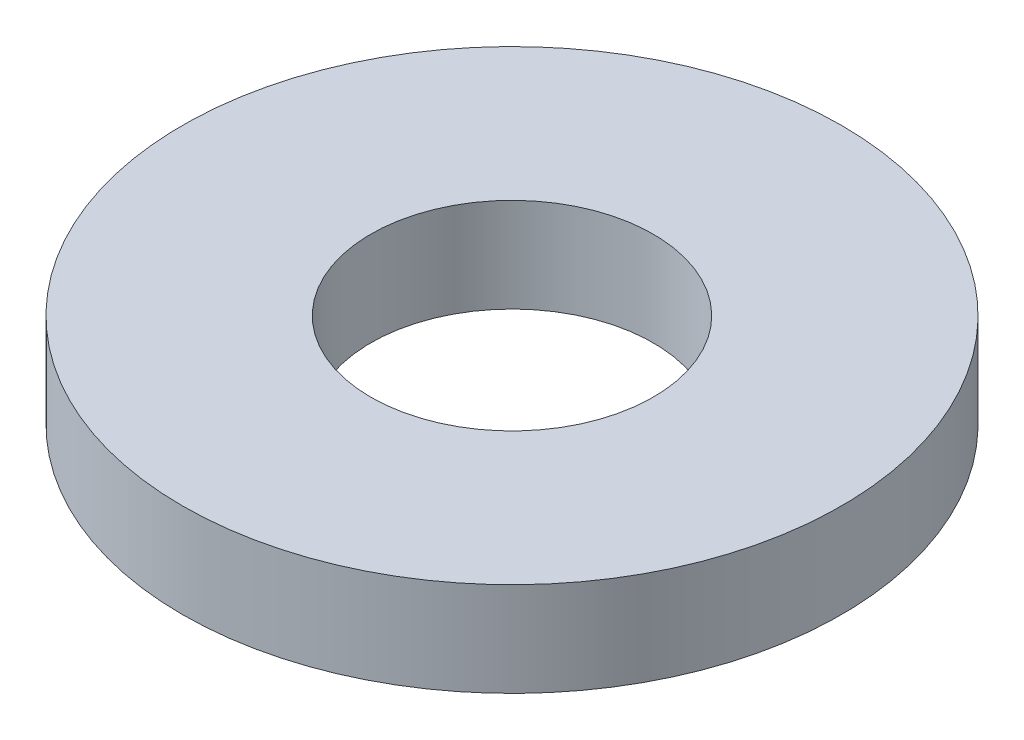
ISO-10303-21;
HEADER;
FILE_DESCRIPTION(('STEP AP214'),'2;1');
FILE_NAME('part.step','',(''),(''),'','','');
FILE_SCHEMA(('AUTOMOTIVE_DESIGN { 1 0 10303 214 1 1 1 1 }'));
ENDSEC;
DATA;
#1=APPLICATION_CONTEXT('core data for automotive mechanical design processes');
#2=APPLICATION_PROTOCOL_DEFINITION('international standard','automotive_design',2000,#1);
#3=PRODUCT_CONTEXT('',#1,'mechanical');
#4=PRODUCT('Part','Part','',(#3));
#5=PRODUCT_RELATED_PRODUCT_CATEGORY('part','',(#4));
#6=PRODUCT_DEFINITION_FORMATION('','',#4);
#7=PRODUCT_DEFINITION_CONTEXT('part definition',#1,'design');
#8=PRODUCT_DEFINITION('design','',#6,#7);
#9=PRODUCT_DEFINITION_SHAPE('','',#8);
#10=(LENGTH_UNIT() NAMED_UNIT(*) SI_UNIT(.MILLI.,.METRE.));
#11=(NAMED_UNIT(*) PLANE_ANGLE_UNIT() SI_UNIT($,.RADIAN.));
#12=(NAMED_UNIT(*) SI_UNIT($,.STERADIAN.) SOLID_ANGLE_UNIT());
#13=UNCERTAINTY_MEASURE_WITH_UNIT(LENGTH_MEASURE(1.E-05),#10,'distance_accuracy_value','');
#14=(GEOMETRIC_REPRESENTATION_CONTEXT(3) GLOBAL_UNCERTAINTY_ASSIGNED_CONTEXT((#13)) GLOBAL_UNIT_ASSIGNED_CONTEXT((#10,
#11,#12)) REPRESENTATION_CONTEXT('',''));
#15=CARTESIAN_POINT('',(0.,0.,0.));
#16=DIRECTION('',(0.,0.,1.));
#17=DIRECTION('',(1.,0.,0.));
#18=AXIS2_PLACEMENT_3D('',#15,#16,#17);
#19=CARTESIAN_POINT('',(0.,1.,0.));
#20=DIRECTION('',(0.,1.,0.));
#21=DIRECTION('',(0.,0.,1.));
#22=AXIS2_PLACEMENT_3D('',#19,#20,#21);
#23=PLANE('',#22);
#24=CARTESIAN_POINT('',(0.,1.,0.));
#25=DIRECTION('',(0.,1.,0.));
#26=DIRECTION('',(0.,0.,1.));
#27=AXIS2_PLACEMENT_3D('',#24,#25,#26);
#28=CIRCLE('',#27,3.5);
#29=CARTESIAN_POINT('',(0.,1.,3.5));
#30=VERTEX_POINT('',#29);
#31=EDGE_CURVE('E10',#30,#30,#28,.T.);
#32=ORIENTED_EDGE('',*,*,#31,.T.);
#33=EDGE_LOOP('',(#32));
#34=FACE_BOUND('',#33,.T.);
#35=CARTESIAN_POINT('',(0.,1.,0.));
#36=DIRECTION('',(0.,1.,0.));
#37=DIRECTION('',(0.,0.,1.));
#38=AXIS2_PLACEMENT_3D('',#35,#36,#37);
#39=CIRCLE('',#38,1.5);
#40=CARTESIAN_POINT('',(0.,1.,1.5));
#41=VERTEX_POINT('',#40);
#42=EDGE_CURVE('E54',#41,#41,#39,.T.);
#43=ORIENTED_EDGE('',*,*,#42,.F.);
#44=EDGE_LOOP('',(#43));
#45=FACE_BOUND('',#44,.T.);
#46=ADVANCED_FACE('F41',(#34,#45),#23,.T.);
#47=CARTESIAN_POINT('',(0.,0.,0.));
#48=DIRECTION('',(0.,1.,0.));
#49=DIRECTION('',(0.,0.,1.));
#50=AXIS2_PLACEMENT_3D('',#47,#48,#49);
#51=PLANE('',#50);
#52=CARTESIAN_POINT('',(0.,0.,0.));
#53=DIRECTION('',(0.,1.,0.));
#54=DIRECTION('',(0.,0.,1.));
#55=AXIS2_PLACEMENT_3D('',#52,#53,#54);
#56=CIRCLE('',#55,3.5);
#57=CARTESIAN_POINT('',(0.,0.,3.5));
#58=VERTEX_POINT('',#57);
#59=EDGE_CURVE('E45',#58,#58,#56,.T.);
#60=ORIENTED_EDGE('',*,*,#59,.F.);
#61=EDGE_LOOP('',(#60));
#62=FACE_BOUND('',#61,.T.);
#63=CARTESIAN_POINT('',(0.,0.,0.));
#64=DIRECTION('',(0.,1.,0.));
#65=DIRECTION('',(0.,0.,1.));
#66=AXIS2_PLACEMENT_3D('',#63,#64,#65);
#67=CIRCLE('',#66,1.5);
#68=CARTESIAN_POINT('',(0.,0.,1.5));
#69=VERTEX_POINT('',#68);
#70=EDGE_CURVE('E56',#69,#69,#67,.T.);
#71=ORIENTED_EDGE('',*,*,#70,.T.);
#72=EDGE_LOOP('',(#71));
#73=FACE_BOUND('',#72,.T.);
#74=ADVANCED_FACE('F68',(#62,#73),#51,.F.);
#75=CARTESIAN_POINT('',(0.,1.,0.));
#76=DIRECTION('',(0.,-1.,0.));
#77=DIRECTION('',(0.,0.,-1.));
#78=AXIS2_PLACEMENT_3D('',#75,#76,#77);
#79=CYLINDRICAL_SURFACE('',#78,3.5);
#80=ORIENTED_EDGE('',*,*,#31,.F.);
#81=EDGE_LOOP('',(#80));
#82=FACE_BOUND('',#81,.T.);
#83=ORIENTED_EDGE('',*,*,#59,.T.);
#84=EDGE_LOOP('',(#83));
#85=FACE_BOUND('',#84,.T.);
#86=ADVANCED_FACE('F43',(#82,#85),#79,.T.);
#87=CARTESIAN_POINT('',(0.,1.,0.));
#88=DIRECTION('',(0.,-1.,0.));
#89=DIRECTION('',(0.,0.,-1.));
#90=AXIS2_PLACEMENT_3D('',#87,#88,#89);
#91=CYLINDRICAL_SURFACE('',#90,1.5);
#92=ORIENTED_EDGE('',*,*,#42,.T.);
#93=EDGE_LOOP('',(#92));
#94=FACE_BOUND('',#93,.T.);
#95=ORIENTED_EDGE('',*,*,#70,.F.);
#96=EDGE_LOOP('',(#95));
#97=FACE_BOUND('',#96,.T.);
#98=ADVANCED_FACE('F64',(#94,#97),#91,.F.);
#99=CLOSED_SHELL('',(#46,#74,#86,#98));
#100=MANIFOLD_SOLID_BREP('B2',#99);
#101=ADVANCED_BREP_SHAPE_REPRESENTATION('',(#18,#100),#14);
#102=SHAPE_DEFINITION_REPRESENTATION(#9,#101);
ENDSEC;
END-ISO-10303-21;
